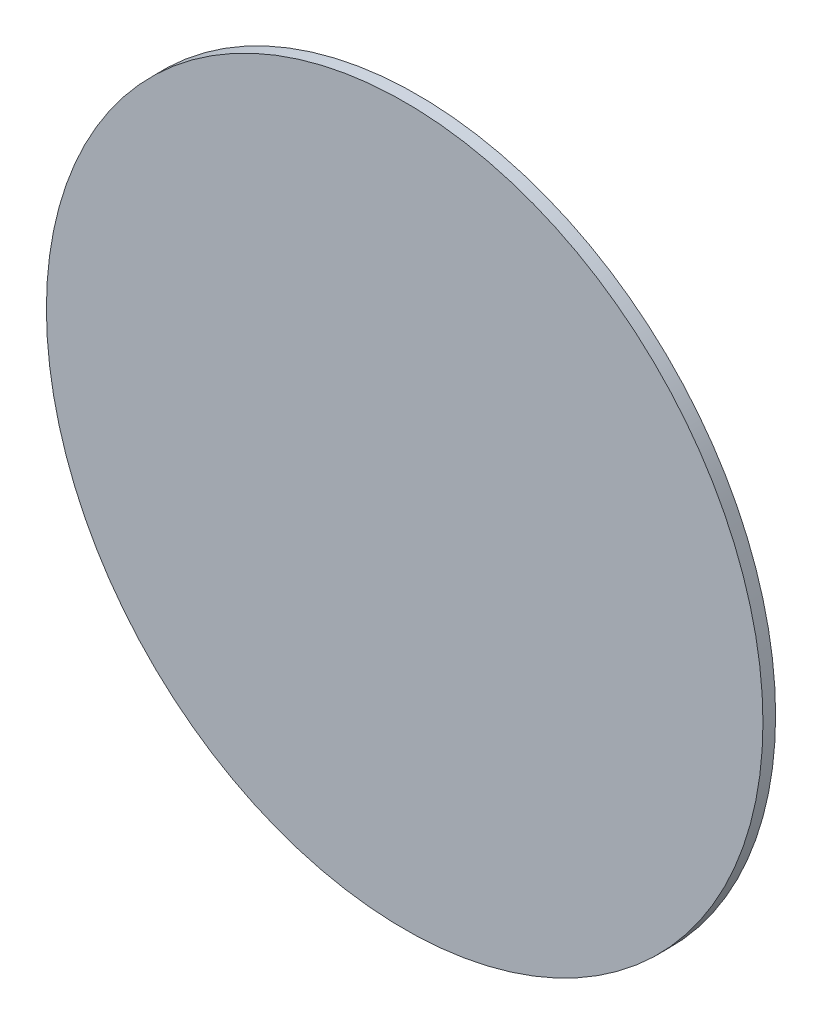
ISO-10303-21;
HEADER;
FILE_DESCRIPTION(('STEP AP214'),'2;1');
FILE_NAME('part.step','',(''),(''),'','','');
FILE_SCHEMA(('AUTOMOTIVE_DESIGN { 1 0 10303 214 1 1 1 1 }'));
ENDSEC;
DATA;
#1=APPLICATION_CONTEXT('core data for automotive mechanical design processes');
#2=APPLICATION_PROTOCOL_DEFINITION('international standard','automotive_design',2000,#1);
#3=PRODUCT_CONTEXT('',#1,'mechanical');
#4=PRODUCT('Part','Part','',(#3));
#5=PRODUCT_RELATED_PRODUCT_CATEGORY('part','',(#4));
#6=PRODUCT_DEFINITION_FORMATION('','',#4);
#7=PRODUCT_DEFINITION_CONTEXT('part definition',#1,'design');
#8=PRODUCT_DEFINITION('design','',#6,#7);
#9=PRODUCT_DEFINITION_SHAPE('','',#8);
#10=(LENGTH_UNIT() NAMED_UNIT(*) SI_UNIT(.MILLI.,.METRE.));
#11=(NAMED_UNIT(*) PLANE_ANGLE_UNIT() SI_UNIT($,.RADIAN.));
#12=(NAMED_UNIT(*) SI_UNIT($,.STERADIAN.) SOLID_ANGLE_UNIT());
#13=UNCERTAINTY_MEASURE_WITH_UNIT(LENGTH_MEASURE(1.E-05),#10,'distance_accuracy_value','');
#14=(GEOMETRIC_REPRESENTATION_CONTEXT(3) GLOBAL_UNCERTAINTY_ASSIGNED_CONTEXT((#13)) GLOBAL_UNIT_ASSIGNED_CONTEXT((#10,
#11,#12)) REPRESENTATION_CONTEXT('',''));
#15=CARTESIAN_POINT('',(0.,0.,0.));
#16=DIRECTION('',(0.,0.,1.));
#17=DIRECTION('',(1.,0.,0.));
#18=AXIS2_PLACEMENT_3D('',#15,#16,#17);
#19=CARTESIAN_POINT('',(0.,0.,3.175));
#20=DIRECTION('',(0.,0.,-1.));
#21=DIRECTION('',(-1.,0.,0.));
#22=AXIS2_PLACEMENT_3D('',#19,#20,#21);
#23=CYLINDRICAL_SURFACE('',#22,90.);
#24=CARTESIAN_POINT('',(0.,0.,3.175));
#25=DIRECTION('',(0.,0.,1.));
#26=DIRECTION('',(1.,0.,0.));
#27=AXIS2_PLACEMENT_3D('',#24,#25,#26);
#28=CIRCLE('',#27,90.);
#29=CARTESIAN_POINT('',(90.,0.,3.175));
#30=VERTEX_POINT('',#29);
#31=EDGE_CURVE('E10',#30,#30,#28,.T.);
#32=ORIENTED_EDGE('',*,*,#31,.F.);
#33=EDGE_LOOP('',(#32));
#34=FACE_BOUND('',#33,.T.);
#35=CARTESIAN_POINT('',(0.,0.,0.));
#36=DIRECTION('',(0.,0.,1.));
#37=DIRECTION('',(1.,0.,0.));
#38=AXIS2_PLACEMENT_3D('',#35,#36,#37);
#39=CIRCLE('',#38,90.);
#40=CARTESIAN_POINT('',(90.,0.,0.));
#41=VERTEX_POINT('',#40);
#42=EDGE_CURVE('E40',#41,#41,#39,.T.);
#43=ORIENTED_EDGE('',*,*,#42,.T.);
#44=EDGE_LOOP('',(#43));
#45=FACE_BOUND('',#44,.T.);
#46=ADVANCED_FACE('F37',(#34,#45),#23,.T.);
#47=CARTESIAN_POINT('',(0.,0.,3.175));
#48=DIRECTION('',(0.,0.,1.));
#49=DIRECTION('',(1.,0.,0.));
#50=AXIS2_PLACEMENT_3D('',#47,#48,#49);
#51=PLANE('',#50);
#52=ORIENTED_EDGE('',*,*,#31,.T.);
#53=EDGE_LOOP('',(#52));
#54=FACE_BOUND('',#53,.T.);
#55=ADVANCED_FACE('F52',(#54),#51,.T.);
#56=CARTESIAN_POINT('',(0.,0.,0.));
#57=DIRECTION('',(0.,0.,1.));
#58=DIRECTION('',(1.,0.,0.));
#59=AXIS2_PLACEMENT_3D('',#56,#57,#58);
#60=PLANE('',#59);
#61=ORIENTED_EDGE('',*,*,#42,.F.);
#62=EDGE_LOOP('',(#61));
#63=FACE_BOUND('',#62,.T.);
#64=ADVANCED_FACE('F50',(#63),#60,.F.);
#65=CLOSED_SHELL('',(#46,#55,#64));
#66=MANIFOLD_SOLID_BREP('B2',#65);
#67=ADVANCED_BREP_SHAPE_REPRESENTATION('',(#18,#66),#14);
#68=SHAPE_DEFINITION_REPRESENTATION(#9,#67);
ENDSEC;
END-ISO-10303-21;
